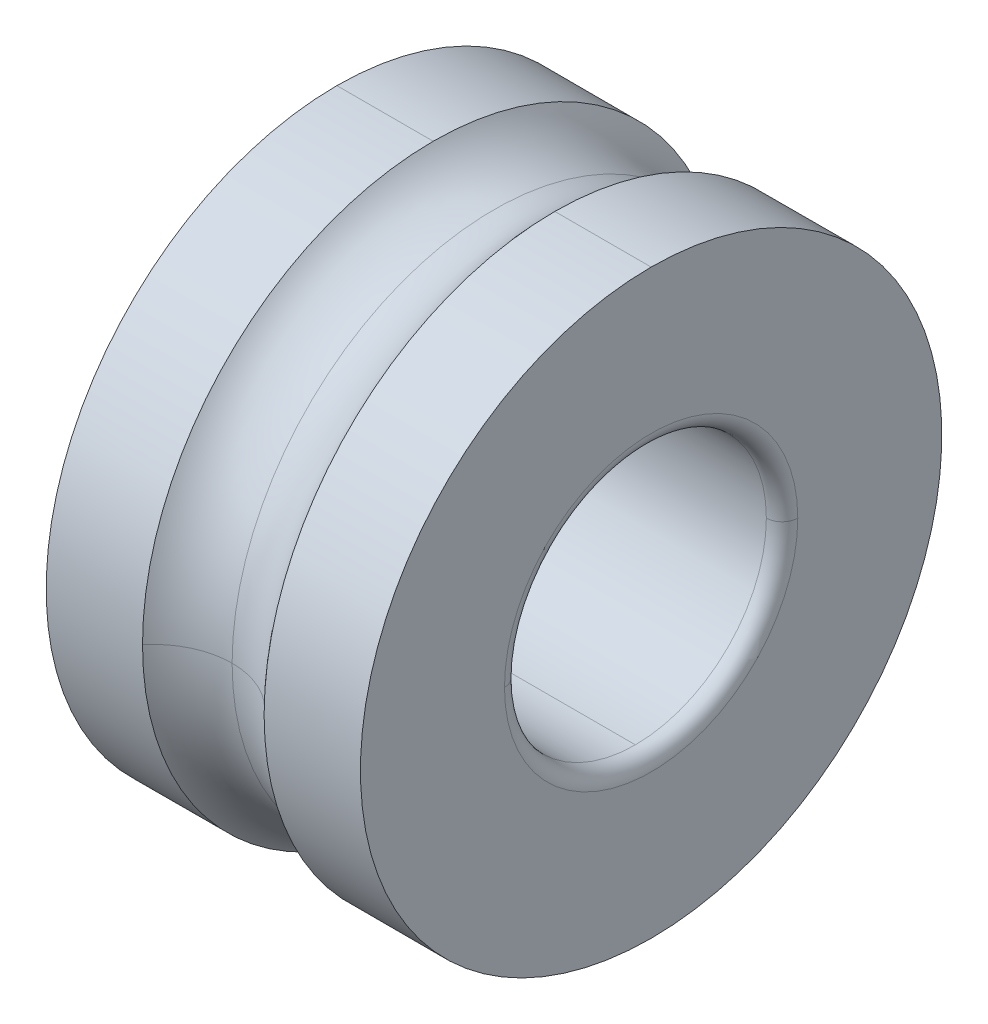
ISO-10303-21;
HEADER;
FILE_DESCRIPTION(('STEP AP214'),'2;1');
FILE_NAME('part.step','',(''),(''),'','','');
FILE_SCHEMA(('AUTOMOTIVE_DESIGN { 1 0 10303 214 1 1 1 1 }'));
ENDSEC;
DATA;
#1=APPLICATION_CONTEXT('core data for automotive mechanical design processes');
#2=APPLICATION_PROTOCOL_DEFINITION('international standard','automotive_design',2000,#1);
#3=PRODUCT_CONTEXT('',#1,'mechanical');
#4=PRODUCT('Part','Part','',(#3));
#5=PRODUCT_RELATED_PRODUCT_CATEGORY('part','',(#4));
#6=PRODUCT_DEFINITION_FORMATION('','',#4);
#7=PRODUCT_DEFINITION_CONTEXT('part definition',#1,'design');
#8=PRODUCT_DEFINITION('design','',#6,#7);
#9=PRODUCT_DEFINITION_SHAPE('','',#8);
#10=(LENGTH_UNIT() NAMED_UNIT(*) SI_UNIT(.MILLI.,.METRE.));
#11=(NAMED_UNIT(*) PLANE_ANGLE_UNIT() SI_UNIT($,.RADIAN.));
#12=(NAMED_UNIT(*) SI_UNIT($,.STERADIAN.) SOLID_ANGLE_UNIT());
#13=UNCERTAINTY_MEASURE_WITH_UNIT(LENGTH_MEASURE(1.E-05),#10,'distance_accuracy_value','');
#14=(GEOMETRIC_REPRESENTATION_CONTEXT(3) GLOBAL_UNCERTAINTY_ASSIGNED_CONTEXT((#13)) GLOBAL_UNIT_ASSIGNED_CONTEXT((#10,
#11,#12)) REPRESENTATION_CONTEXT('',''));
#15=CARTESIAN_POINT('',(0.,0.,0.));
#16=DIRECTION('',(0.,0.,1.));
#17=DIRECTION('',(1.,0.,0.));
#18=AXIS2_PLACEMENT_3D('',#15,#16,#17);
#19=CARTESIAN_POINT('',(5.08040933831219,0.,0.));
#20=DIRECTION('',(1.,0.,0.));
#21=DIRECTION('',(0.,1.,0.));
#22=AXIS2_PLACEMENT_3D('',#19,#20,#21);
#23=CYLINDRICAL_SURFACE('',#22,5.55);
#24=DIRECTION('',(1.,0.,0.));
#25=VECTOR('',#24,1.);
#26=CARTESIAN_POINT('',(5.08040933831219,5.55,0.));
#27=LINE('',#26,#25);
#28=CARTESIAN_POINT('',(4.16081867662439,5.55,0.));
#29=VERTEX_POINT('',#28);
#30=CARTESIAN_POINT('',(6.,5.55,0.));
#31=VERTEX_POINT('',#30);
#32=EDGE_CURVE('E143',#29,#31,#27,.T.);
#33=ORIENTED_EDGE('',*,*,#32,.T.);
#34=CARTESIAN_POINT('',(6.,0.,0.));
#35=DIRECTION('',(1.,0.,0.));
#36=DIRECTION('',(0.,1.,0.));
#37=AXIS2_PLACEMENT_3D('',#34,#35,#36);
#38=CIRCLE('',#37,5.55);
#39=CARTESIAN_POINT('',(6.,-5.55,0.));
#40=VERTEX_POINT('',#39);
#41=EDGE_CURVE('E190',#40,#31,#38,.T.);
#42=ORIENTED_EDGE('',*,*,#41,.F.);
#43=DIRECTION('',(-1.,0.,0.));
#44=VECTOR('',#43,1.);
#45=CARTESIAN_POINT('',(5.08040933831219,-5.55,0.));
#46=LINE('',#45,#44);
#47=CARTESIAN_POINT('',(4.16081867662439,-5.55,0.));
#48=VERTEX_POINT('',#47);
#49=EDGE_CURVE('E140',#40,#48,#46,.T.);
#50=ORIENTED_EDGE('',*,*,#49,.T.);
#51=CARTESIAN_POINT('',(4.16081867662439,0.,0.));
#52=DIRECTION('',(1.,0.,0.));
#53=DIRECTION('',(0.,1.,0.));
#54=AXIS2_PLACEMENT_3D('',#51,#52,#53);
#55=CIRCLE('',#54,5.55);
#56=CARTESIAN_POINT('',(4.16081867662439,0.,-5.55));
#57=VERTEX_POINT('',#56);
#58=EDGE_CURVE('E205',#48,#57,#55,.T.);
#59=ORIENTED_EDGE('',*,*,#58,.T.);
#60=CARTESIAN_POINT('',(4.16081867662439,0.,0.));
#61=DIRECTION('',(1.,0.,0.));
#62=DIRECTION('',(0.,1.,0.));
#63=AXIS2_PLACEMENT_3D('',#60,#61,#62);
#64=CIRCLE('',#63,5.55);
#65=EDGE_CURVE('E209',#57,#29,#64,.T.);
#66=ORIENTED_EDGE('',*,*,#65,.T.);
#67=EDGE_LOOP('',(#33,#42,#50,#59,#66));
#68=FACE_BOUND('',#67,.T.);
#69=ADVANCED_FACE('F17',(#68),#23,.T.);
#70=CARTESIAN_POINT('',(3.,0.,0.));
#71=DIRECTION('',(1.,0.,0.));
#72=DIRECTION('',(0.,0.,-1.));
#73=AXIS2_PLACEMENT_3D('',#70,#71,#72);
#74=TOROIDAL_SURFACE('',#73,6.5,1.5);
#75=CARTESIAN_POINT('',(3.,0.,0.));
#76=DIRECTION('',(-1.,0.,0.));
#77=DIRECTION('',(0.,0.,1.));
#78=AXIS2_PLACEMENT_3D('',#75,#76,#77);
#79=CIRCLE('',#78,5.);
#80=CARTESIAN_POINT('',(3.,0.,5.));
#81=VERTEX_POINT('',#80);
#82=CARTESIAN_POINT('',(3.,0.,-5.));
#83=VERTEX_POINT('',#82);
#84=EDGE_CURVE('E227',#81,#83,#79,.T.);
#85=ORIENTED_EDGE('',*,*,#84,.T.);
#86=CARTESIAN_POINT('',(3.,0.,-6.5));
#87=DIRECTION('',(0.,-1.,0.));
#88=DIRECTION('',(0.,0.,-1.));
#89=AXIS2_PLACEMENT_3D('',#86,#87,#88);
#90=CIRCLE('',#89,1.5);
#91=CARTESIAN_POINT('',(1.83918132337561,0.,-5.55));
#92=VERTEX_POINT('',#91);
#93=EDGE_CURVE('E146',#83,#92,#90,.T.);
#94=ORIENTED_EDGE('',*,*,#93,.T.);
#95=CARTESIAN_POINT('',(1.83918132337561,0.,0.));
#96=DIRECTION('',(1.,0.,0.));
#97=DIRECTION('',(0.,1.,0.));
#98=AXIS2_PLACEMENT_3D('',#95,#96,#97);
#99=CIRCLE('',#98,5.55);
#100=CARTESIAN_POINT('',(1.83918132337561,5.55,0.));
#101=VERTEX_POINT('',#100);
#102=EDGE_CURVE('E11',#92,#101,#99,.T.);
#103=ORIENTED_EDGE('',*,*,#102,.T.);
#104=CARTESIAN_POINT('',(1.83918132337561,0.,0.));
#105=DIRECTION('',(1.,0.,0.));
#106=DIRECTION('',(0.,1.,0.));
#107=AXIS2_PLACEMENT_3D('',#104,#105,#106);
#108=CIRCLE('',#107,5.55);
#109=CARTESIAN_POINT('',(1.83918132337561,0.,5.55));
#110=VERTEX_POINT('',#109);
#111=EDGE_CURVE('E109',#101,#110,#108,.T.);
#112=ORIENTED_EDGE('',*,*,#111,.T.);
#113=CARTESIAN_POINT('',(3.,0.,6.5));
#114=DIRECTION('',(0.,-1.,0.));
#115=DIRECTION('',(0.,0.,1.));
#116=AXIS2_PLACEMENT_3D('',#113,#114,#115);
#117=CIRCLE('',#116,1.5);
#118=EDGE_CURVE('E114',#110,#81,#117,.T.);
#119=ORIENTED_EDGE('',*,*,#118,.T.);
#120=EDGE_LOOP('',(#85,#94,#103,#112,#119));
#121=FACE_BOUND('',#120,.T.);
#122=ADVANCED_FACE('F112',(#121),#74,.F.);
#123=CARTESIAN_POINT('',(0.919590661687805,0.,0.));
#124=DIRECTION('',(1.,0.,0.));
#125=DIRECTION('',(0.,1.,0.));
#126=AXIS2_PLACEMENT_3D('',#123,#124,#125);
#127=CYLINDRICAL_SURFACE('',#126,5.55);
#128=DIRECTION('',(1.,0.,0.));
#129=VECTOR('',#128,1.);
#130=CARTESIAN_POINT('',(0.919590661687805,5.55,0.));
#131=LINE('',#130,#129);
#132=CARTESIAN_POINT('',(0.,5.55,0.));
#133=VERTEX_POINT('',#132);
#134=EDGE_CURVE('E148',#133,#101,#131,.T.);
#135=ORIENTED_EDGE('',*,*,#134,.T.);
#136=ORIENTED_EDGE('',*,*,#102,.F.);
#137=CARTESIAN_POINT('',(1.83918132337561,0.,0.));
#138=DIRECTION('',(1.,0.,0.));
#139=DIRECTION('',(0.,1.,0.));
#140=AXIS2_PLACEMENT_3D('',#137,#138,#139);
#141=CIRCLE('',#140,5.55);
#142=CARTESIAN_POINT('',(1.83918132337561,-5.55,0.));
#143=VERTEX_POINT('',#142);
#144=EDGE_CURVE('E131',#143,#92,#141,.T.);
#145=ORIENTED_EDGE('',*,*,#144,.F.);
#146=DIRECTION('',(-1.,0.,0.));
#147=VECTOR('',#146,1.);
#148=CARTESIAN_POINT('',(0.919590661687805,-5.55,0.));
#149=LINE('',#148,#147);
#150=CARTESIAN_POINT('',(0.,-5.55,0.));
#151=VERTEX_POINT('',#150);
#152=EDGE_CURVE('E121',#143,#151,#149,.T.);
#153=ORIENTED_EDGE('',*,*,#152,.T.);
#154=CARTESIAN_POINT('',(0.,0.,0.));
#155=DIRECTION('',(1.,0.,0.));
#156=DIRECTION('',(0.,1.,0.));
#157=AXIS2_PLACEMENT_3D('',#154,#155,#156);
#158=CIRCLE('',#157,5.55);
#159=EDGE_CURVE('E24',#151,#133,#158,.T.);
#160=ORIENTED_EDGE('',*,*,#159,.T.);
#161=EDGE_LOOP('',(#135,#136,#145,#153,#160));
#162=FACE_BOUND('',#161,.T.);
#163=ADVANCED_FACE('F229',(#162),#127,.T.);
#164=CARTESIAN_POINT('',(0.,4.175,0.));
#165=DIRECTION('',(-1.,0.,0.));
#166=DIRECTION('',(0.,0.,1.));
#167=AXIS2_PLACEMENT_3D('',#164,#165,#166);
#168=PLANE('',#167);
#169=CARTESIAN_POINT('',(0.,0.,0.));
#170=DIRECTION('',(1.,0.,0.));
#171=DIRECTION('',(0.,1.,0.));
#172=AXIS2_PLACEMENT_3D('',#169,#170,#171);
#173=CIRCLE('',#172,2.8);
#174=CARTESIAN_POINT('',(0.,0.,2.8));
#175=VERTEX_POINT('',#174);
#176=CARTESIAN_POINT('',(0.,0.,-2.8));
#177=VERTEX_POINT('',#176);
#178=EDGE_CURVE('E195',#175,#177,#173,.T.);
#179=ORIENTED_EDGE('',*,*,#178,.T.);
#180=CARTESIAN_POINT('',(0.,0.,0.));
#181=DIRECTION('',(1.,0.,0.));
#182=DIRECTION('',(0.,1.,0.));
#183=AXIS2_PLACEMENT_3D('',#180,#181,#182);
#184=CIRCLE('',#183,2.8);
#185=EDGE_CURVE('E164',#177,#175,#184,.T.);
#186=ORIENTED_EDGE('',*,*,#185,.T.);
#187=EDGE_LOOP('',(#179,#186));
#188=FACE_BOUND('',#187,.T.);
#189=CARTESIAN_POINT('',(0.,0.,0.));
#190=DIRECTION('',(1.,0.,0.));
#191=DIRECTION('',(0.,1.,0.));
#192=AXIS2_PLACEMENT_3D('',#189,#190,#191);
#193=CIRCLE('',#192,5.55);
#194=EDGE_CURVE('E150',#133,#151,#193,.T.);
#195=ORIENTED_EDGE('',*,*,#194,.F.);
#196=ORIENTED_EDGE('',*,*,#159,.F.);
#197=EDGE_LOOP('',(#195,#196));
#198=FACE_BOUND('',#197,.T.);
#199=ADVANCED_FACE('F262',(#188,#198),#168,.T.);
#200=CARTESIAN_POINT('',(0.3,0.,0.));
#201=DIRECTION('',(1.,0.,0.));
#202=DIRECTION('',(0.,0.,-1.));
#203=AXIS2_PLACEMENT_3D('',#200,#201,#202);
#204=TOROIDAL_SURFACE('',#203,2.8,0.3);
#205=CARTESIAN_POINT('',(0.3,0.,-2.8));
#206=DIRECTION('',(0.,-1.,0.));
#207=DIRECTION('',(0.,0.,-1.));
#208=AXIS2_PLACEMENT_3D('',#205,#206,#207);
#209=CIRCLE('',#208,0.3);
#210=CARTESIAN_POINT('',(0.3,0.,-2.5));
#211=VERTEX_POINT('',#210);
#212=EDGE_CURVE('E120',#211,#177,#209,.T.);
#213=ORIENTED_EDGE('',*,*,#212,.T.);
#214=ORIENTED_EDGE('',*,*,#178,.F.);
#215=CARTESIAN_POINT('',(0.3,0.,2.8));
#216=DIRECTION('',(0.,-1.,0.));
#217=DIRECTION('',(0.,0.,1.));
#218=AXIS2_PLACEMENT_3D('',#215,#216,#217);
#219=CIRCLE('',#218,0.3);
#220=CARTESIAN_POINT('',(0.3,0.,2.5));
#221=VERTEX_POINT('',#220);
#222=EDGE_CURVE('E161',#175,#221,#219,.T.);
#223=ORIENTED_EDGE('',*,*,#222,.T.);
#224=CARTESIAN_POINT('',(0.3,0.,0.));
#225=DIRECTION('',(1.,0.,0.));
#226=DIRECTION('',(0.,1.,0.));
#227=AXIS2_PLACEMENT_3D('',#224,#225,#226);
#228=CIRCLE('',#227,2.5);
#229=CARTESIAN_POINT('',(0.3,-2.5,0.));
#230=VERTEX_POINT('',#229);
#231=EDGE_CURVE('E194',#221,#230,#228,.T.);
#232=ORIENTED_EDGE('',*,*,#231,.T.);
#233=CARTESIAN_POINT('',(0.3,0.,0.));
#234=DIRECTION('',(1.,0.,0.));
#235=DIRECTION('',(0.,1.,0.));
#236=AXIS2_PLACEMENT_3D('',#233,#234,#235);
#237=CIRCLE('',#236,2.5);
#238=EDGE_CURVE('E170',#230,#211,#237,.T.);
#239=ORIENTED_EDGE('',*,*,#238,.T.);
#240=EDGE_LOOP('',(#213,#214,#223,#232,#239));
#241=FACE_BOUND('',#240,.T.);
#242=ADVANCED_FACE('F267',(#241),#204,.T.);
#243=CARTESIAN_POINT('',(3.,0.,0.));
#244=DIRECTION('',(1.,0.,0.));
#245=DIRECTION('',(0.,1.,0.));
#246=AXIS2_PLACEMENT_3D('',#243,#244,#245);
#247=CYLINDRICAL_SURFACE('',#246,2.5);
#248=DIRECTION('',(1.,0.,0.));
#249=VECTOR('',#248,1.);
#250=CARTESIAN_POINT('',(3.,2.5,0.));
#251=LINE('',#250,#249);
#252=CARTESIAN_POINT('',(0.3,2.5,0.));
#253=VERTEX_POINT('',#252);
#254=CARTESIAN_POINT('',(5.7,2.5,0.));
#255=VERTEX_POINT('',#254);
#256=EDGE_CURVE('E167',#253,#255,#251,.T.);
#257=ORIENTED_EDGE('',*,*,#256,.T.);
#258=CARTESIAN_POINT('',(5.7,0.,0.));
#259=DIRECTION('',(1.,0.,0.));
#260=DIRECTION('',(0.,1.,0.));
#261=AXIS2_PLACEMENT_3D('',#258,#259,#260);
#262=CIRCLE('',#261,2.5);
#263=CARTESIAN_POINT('',(5.7,0.,2.5));
#264=VERTEX_POINT('',#263);
#265=EDGE_CURVE('E188',#255,#264,#262,.T.);
#266=ORIENTED_EDGE('',*,*,#265,.T.);
#267=CARTESIAN_POINT('',(5.7,0.,0.));
#268=DIRECTION('',(1.,0.,0.));
#269=DIRECTION('',(0.,1.,0.));
#270=AXIS2_PLACEMENT_3D('',#267,#268,#269);
#271=CIRCLE('',#270,2.5);
#272=CARTESIAN_POINT('',(5.7,-2.5,0.));
#273=VERTEX_POINT('',#272);
#274=EDGE_CURVE('E31',#264,#273,#271,.T.);
#275=ORIENTED_EDGE('',*,*,#274,.T.);
#276=DIRECTION('',(-1.,0.,0.));
#277=VECTOR('',#276,1.);
#278=CARTESIAN_POINT('',(3.,-2.5,0.));
#279=LINE('',#278,#277);
#280=EDGE_CURVE('E172',#273,#230,#279,.T.);
#281=ORIENTED_EDGE('',*,*,#280,.T.);
#282=ORIENTED_EDGE('',*,*,#231,.F.);
#283=CARTESIAN_POINT('',(0.3,0.,0.));
#284=DIRECTION('',(1.,0.,0.));
#285=DIRECTION('',(0.,1.,0.));
#286=AXIS2_PLACEMENT_3D('',#283,#284,#285);
#287=CIRCLE('',#286,2.5);
#288=EDGE_CURVE('E158',#253,#221,#287,.T.);
#289=ORIENTED_EDGE('',*,*,#288,.F.);
#290=EDGE_LOOP('',(#257,#266,#275,#281,#282,#289));
#291=FACE_BOUND('',#290,.T.);
#292=ADVANCED_FACE('F252',(#291),#247,.F.);
#293=CARTESIAN_POINT('',(5.7,0.,0.));
#294=DIRECTION('',(1.,0.,0.));
#295=DIRECTION('',(0.,0.,-1.));
#296=AXIS2_PLACEMENT_3D('',#293,#294,#295);
#297=TOROIDAL_SURFACE('',#296,2.8,0.3);
#298=CARTESIAN_POINT('',(5.7,0.,-2.8));
#299=DIRECTION('',(0.,-1.,0.));
#300=DIRECTION('',(0.,0.,-1.));
#301=AXIS2_PLACEMENT_3D('',#298,#299,#300);
#302=CIRCLE('',#301,0.3);
#303=CARTESIAN_POINT('',(6.,0.,-2.8));
#304=VERTEX_POINT('',#303);
#305=CARTESIAN_POINT('',(5.7,0.,-2.5));
#306=VERTEX_POINT('',#305);
#307=EDGE_CURVE('E181',#304,#306,#302,.T.);
#308=ORIENTED_EDGE('',*,*,#307,.T.);
#309=CARTESIAN_POINT('',(5.7,0.,0.));
#310=DIRECTION('',(1.,0.,0.));
#311=DIRECTION('',(0.,1.,0.));
#312=AXIS2_PLACEMENT_3D('',#309,#310,#311);
#313=CIRCLE('',#312,2.5);
#314=EDGE_CURVE('E175',#273,#306,#313,.T.);
#315=ORIENTED_EDGE('',*,*,#314,.F.);
#316=ORIENTED_EDGE('',*,*,#274,.F.);
#317=CARTESIAN_POINT('',(5.7,0.,2.8));
#318=DIRECTION('',(0.,-1.,0.));
#319=DIRECTION('',(0.,0.,1.));
#320=AXIS2_PLACEMENT_3D('',#317,#318,#319);
#321=CIRCLE('',#320,0.3);
#322=CARTESIAN_POINT('',(6.,0.,2.8));
#323=VERTEX_POINT('',#322);
#324=EDGE_CURVE('E186',#264,#323,#321,.T.);
#325=ORIENTED_EDGE('',*,*,#324,.T.);
#326=CARTESIAN_POINT('',(6.,0.,0.));
#327=DIRECTION('',(1.,0.,0.));
#328=DIRECTION('',(0.,1.,0.));
#329=AXIS2_PLACEMENT_3D('',#326,#327,#328);
#330=CIRCLE('',#329,2.8);
#331=EDGE_CURVE('E38',#323,#304,#330,.T.);
#332=ORIENTED_EDGE('',*,*,#331,.T.);
#333=EDGE_LOOP('',(#308,#315,#316,#325,#332));
#334=FACE_BOUND('',#333,.T.);
#335=ADVANCED_FACE('F242',(#334),#297,.T.);
#336=CARTESIAN_POINT('',(6.,4.175,0.));
#337=DIRECTION('',(1.,0.,0.));
#338=DIRECTION('',(0.,1.,0.));
#339=AXIS2_PLACEMENT_3D('',#336,#337,#338);
#340=PLANE('',#339);
#341=CARTESIAN_POINT('',(6.,0.,0.));
#342=DIRECTION('',(1.,0.,0.));
#343=DIRECTION('',(0.,1.,0.));
#344=AXIS2_PLACEMENT_3D('',#341,#342,#343);
#345=CIRCLE('',#344,2.8);
#346=EDGE_CURVE('E183',#304,#323,#345,.T.);
#347=ORIENTED_EDGE('',*,*,#346,.F.);
#348=ORIENTED_EDGE('',*,*,#331,.F.);
#349=EDGE_LOOP('',(#347,#348));
#350=FACE_BOUND('',#349,.T.);
#351=CARTESIAN_POINT('',(6.,0.,0.));
#352=DIRECTION('',(1.,0.,0.));
#353=DIRECTION('',(0.,1.,0.));
#354=AXIS2_PLACEMENT_3D('',#351,#352,#353);
#355=CIRCLE('',#354,5.55);
#356=EDGE_CURVE('E137',#31,#40,#355,.T.);
#357=ORIENTED_EDGE('',*,*,#356,.T.);
#358=ORIENTED_EDGE('',*,*,#41,.T.);
#359=EDGE_LOOP('',(#357,#358));
#360=FACE_BOUND('',#359,.T.);
#361=ADVANCED_FACE('F239',(#350,#360),#340,.T.);
#362=CARTESIAN_POINT('',(5.7,0.,0.));
#363=DIRECTION('',(1.,0.,0.));
#364=DIRECTION('',(0.,0.,-1.));
#365=AXIS2_PLACEMENT_3D('',#362,#363,#364);
#366=TOROIDAL_SURFACE('',#365,2.8,0.3);
#367=ORIENTED_EDGE('',*,*,#307,.F.);
#368=ORIENTED_EDGE('',*,*,#346,.T.);
#369=ORIENTED_EDGE('',*,*,#324,.F.);
#370=ORIENTED_EDGE('',*,*,#265,.F.);
#371=CARTESIAN_POINT('',(5.7,0.,0.));
#372=DIRECTION('',(1.,0.,0.));
#373=DIRECTION('',(0.,1.,0.));
#374=AXIS2_PLACEMENT_3D('',#371,#372,#373);
#375=CIRCLE('',#374,2.5);
#376=EDGE_CURVE('E178',#306,#255,#375,.T.);
#377=ORIENTED_EDGE('',*,*,#376,.F.);
#378=EDGE_LOOP('',(#367,#368,#369,#370,#377));
#379=FACE_BOUND('',#378,.T.);
#380=ADVANCED_FACE('F241',(#379),#366,.T.);
#381=CARTESIAN_POINT('',(3.,0.,0.));
#382=DIRECTION('',(1.,0.,0.));
#383=DIRECTION('',(0.,1.,0.));
#384=AXIS2_PLACEMENT_3D('',#381,#382,#383);
#385=CYLINDRICAL_SURFACE('',#384,2.5);
#386=ORIENTED_EDGE('',*,*,#256,.F.);
#387=CARTESIAN_POINT('',(0.3,0.,0.));
#388=DIRECTION('',(1.,0.,0.));
#389=DIRECTION('',(0.,1.,0.));
#390=AXIS2_PLACEMENT_3D('',#387,#388,#389);
#391=CIRCLE('',#390,2.5);
#392=EDGE_CURVE('E155',#211,#253,#391,.T.);
#393=ORIENTED_EDGE('',*,*,#392,.F.);
#394=ORIENTED_EDGE('',*,*,#238,.F.);
#395=ORIENTED_EDGE('',*,*,#280,.F.);
#396=ORIENTED_EDGE('',*,*,#314,.T.);
#397=ORIENTED_EDGE('',*,*,#376,.T.);
#398=EDGE_LOOP('',(#386,#393,#394,#395,#396,#397));
#399=FACE_BOUND('',#398,.T.);
#400=ADVANCED_FACE('F249',(#399),#385,.F.);
#401=CARTESIAN_POINT('',(0.3,0.,0.));
#402=DIRECTION('',(1.,0.,0.));
#403=DIRECTION('',(0.,0.,-1.));
#404=AXIS2_PLACEMENT_3D('',#401,#402,#403);
#405=TOROIDAL_SURFACE('',#404,2.8,0.3);
#406=ORIENTED_EDGE('',*,*,#212,.F.);
#407=ORIENTED_EDGE('',*,*,#392,.T.);
#408=ORIENTED_EDGE('',*,*,#288,.T.);
#409=ORIENTED_EDGE('',*,*,#222,.F.);
#410=ORIENTED_EDGE('',*,*,#185,.F.);
#411=EDGE_LOOP('',(#406,#407,#408,#409,#410));
#412=FACE_BOUND('',#411,.T.);
#413=ADVANCED_FACE('F273',(#412),#405,.T.);
#414=CARTESIAN_POINT('',(0.919590661687805,0.,0.));
#415=DIRECTION('',(1.,0.,0.));
#416=DIRECTION('',(0.,1.,0.));
#417=AXIS2_PLACEMENT_3D('',#414,#415,#416);
#418=CYLINDRICAL_SURFACE('',#417,5.55);
#419=ORIENTED_EDGE('',*,*,#134,.F.);
#420=ORIENTED_EDGE('',*,*,#194,.T.);
#421=ORIENTED_EDGE('',*,*,#152,.F.);
#422=CARTESIAN_POINT('',(1.83918132337561,0.,0.));
#423=DIRECTION('',(1.,0.,0.));
#424=DIRECTION('',(0.,1.,0.));
#425=AXIS2_PLACEMENT_3D('',#422,#423,#424);
#426=CIRCLE('',#425,5.55);
#427=EDGE_CURVE('E124',#110,#143,#426,.T.);
#428=ORIENTED_EDGE('',*,*,#427,.F.);
#429=ORIENTED_EDGE('',*,*,#111,.F.);
#430=EDGE_LOOP('',(#419,#420,#421,#428,#429));
#431=FACE_BOUND('',#430,.T.);
#432=ADVANCED_FACE('F125',(#431),#418,.T.);
#433=CARTESIAN_POINT('',(3.,0.,0.));
#434=DIRECTION('',(1.,0.,0.));
#435=DIRECTION('',(0.,0.,-1.));
#436=AXIS2_PLACEMENT_3D('',#433,#434,#435);
#437=TOROIDAL_SURFACE('',#436,6.5,1.5);
#438=CARTESIAN_POINT('',(3.,0.,0.));
#439=DIRECTION('',(-1.,0.,0.));
#440=DIRECTION('',(0.,0.,1.));
#441=AXIS2_PLACEMENT_3D('',#438,#439,#440);
#442=CIRCLE('',#441,5.);
#443=EDGE_CURVE('E135',#83,#81,#442,.T.);
#444=ORIENTED_EDGE('',*,*,#443,.T.);
#445=ORIENTED_EDGE('',*,*,#118,.F.);
#446=ORIENTED_EDGE('',*,*,#427,.T.);
#447=ORIENTED_EDGE('',*,*,#144,.T.);
#448=ORIENTED_EDGE('',*,*,#93,.F.);
#449=EDGE_LOOP('',(#444,#445,#446,#447,#448));
#450=FACE_BOUND('',#449,.T.);
#451=ADVANCED_FACE('F133',(#450),#437,.F.);
#452=CARTESIAN_POINT('',(5.08040933831219,0.,0.));
#453=DIRECTION('',(1.,0.,0.));
#454=DIRECTION('',(0.,1.,0.));
#455=AXIS2_PLACEMENT_3D('',#452,#453,#454);
#456=CYLINDRICAL_SURFACE('',#455,5.55);
#457=ORIENTED_EDGE('',*,*,#32,.F.);
#458=CARTESIAN_POINT('',(4.16081867662439,0.,0.));
#459=DIRECTION('',(1.,0.,0.));
#460=DIRECTION('',(0.,1.,0.));
#461=AXIS2_PLACEMENT_3D('',#458,#459,#460);
#462=CIRCLE('',#461,5.55);
#463=CARTESIAN_POINT('',(4.16081867662439,0.,5.55));
#464=VERTEX_POINT('',#463);
#465=EDGE_CURVE('E215',#29,#464,#462,.T.);
#466=ORIENTED_EDGE('',*,*,#465,.T.);
#467=CARTESIAN_POINT('',(4.16081867662439,0.,0.));
#468=DIRECTION('',(1.,0.,0.));
#469=DIRECTION('',(0.,1.,0.));
#470=AXIS2_PLACEMENT_3D('',#467,#468,#469);
#471=CIRCLE('',#470,5.55);
#472=EDGE_CURVE('E206',#464,#48,#471,.T.);
#473=ORIENTED_EDGE('',*,*,#472,.T.);
#474=ORIENTED_EDGE('',*,*,#49,.F.);
#475=ORIENTED_EDGE('',*,*,#356,.F.);
#476=EDGE_LOOP('',(#457,#466,#473,#474,#475));
#477=FACE_BOUND('',#476,.T.);
#478=ADVANCED_FACE('F236',(#477),#456,.T.);
#479=CARTESIAN_POINT('',(3.,0.,0.));
#480=DIRECTION('',(1.,0.,0.));
#481=DIRECTION('',(0.,0.,-1.));
#482=AXIS2_PLACEMENT_3D('',#479,#480,#481);
#483=TOROIDAL_SURFACE('',#482,6.5,1.5);
#484=ORIENTED_EDGE('',*,*,#443,.F.);
#485=CARTESIAN_POINT('',(3.,0.,-6.5));
#486=DIRECTION('',(0.,-1.,0.));
#487=DIRECTION('',(0.,0.,-1.));
#488=AXIS2_PLACEMENT_3D('',#485,#486,#487);
#489=CIRCLE('',#488,1.5);
#490=EDGE_CURVE('E203',#57,#83,#489,.T.);
#491=ORIENTED_EDGE('',*,*,#490,.F.);
#492=ORIENTED_EDGE('',*,*,#58,.F.);
#493=ORIENTED_EDGE('',*,*,#472,.F.);
#494=CARTESIAN_POINT('',(3.,0.,6.5));
#495=DIRECTION('',(0.,-1.,0.));
#496=DIRECTION('',(0.,0.,1.));
#497=AXIS2_PLACEMENT_3D('',#494,#495,#496);
#498=CIRCLE('',#497,1.5);
#499=EDGE_CURVE('E220',#81,#464,#498,.T.);
#500=ORIENTED_EDGE('',*,*,#499,.F.);
#501=EDGE_LOOP('',(#484,#491,#492,#493,#500));
#502=FACE_BOUND('',#501,.T.);
#503=ADVANCED_FACE('F232',(#502),#483,.F.);
#504=CARTESIAN_POINT('',(3.,0.,0.));
#505=DIRECTION('',(1.,0.,0.));
#506=DIRECTION('',(0.,0.,-1.));
#507=AXIS2_PLACEMENT_3D('',#504,#505,#506);
#508=TOROIDAL_SURFACE('',#507,6.5,1.5);
#509=ORIENTED_EDGE('',*,*,#84,.F.);
#510=ORIENTED_EDGE('',*,*,#499,.T.);
#511=ORIENTED_EDGE('',*,*,#465,.F.);
#512=ORIENTED_EDGE('',*,*,#65,.F.);
#513=ORIENTED_EDGE('',*,*,#490,.T.);
#514=EDGE_LOOP('',(#509,#510,#511,#512,#513));
#515=FACE_BOUND('',#514,.T.);
#516=ADVANCED_FACE('F230',(#515),#508,.F.);
#517=CLOSED_SHELL('',(#69,#122,#163,#199,#242,#292,#335,#361,#380,#400,#413,#432,#451,#478,#503,#516));
#518=MANIFOLD_SOLID_BREP('B1',#517);
#519=ADVANCED_BREP_SHAPE_REPRESENTATION('',(#18,#518),#14);
#520=SHAPE_DEFINITION_REPRESENTATION(#9,#519);
ENDSEC;
END-ISO-10303-21;
